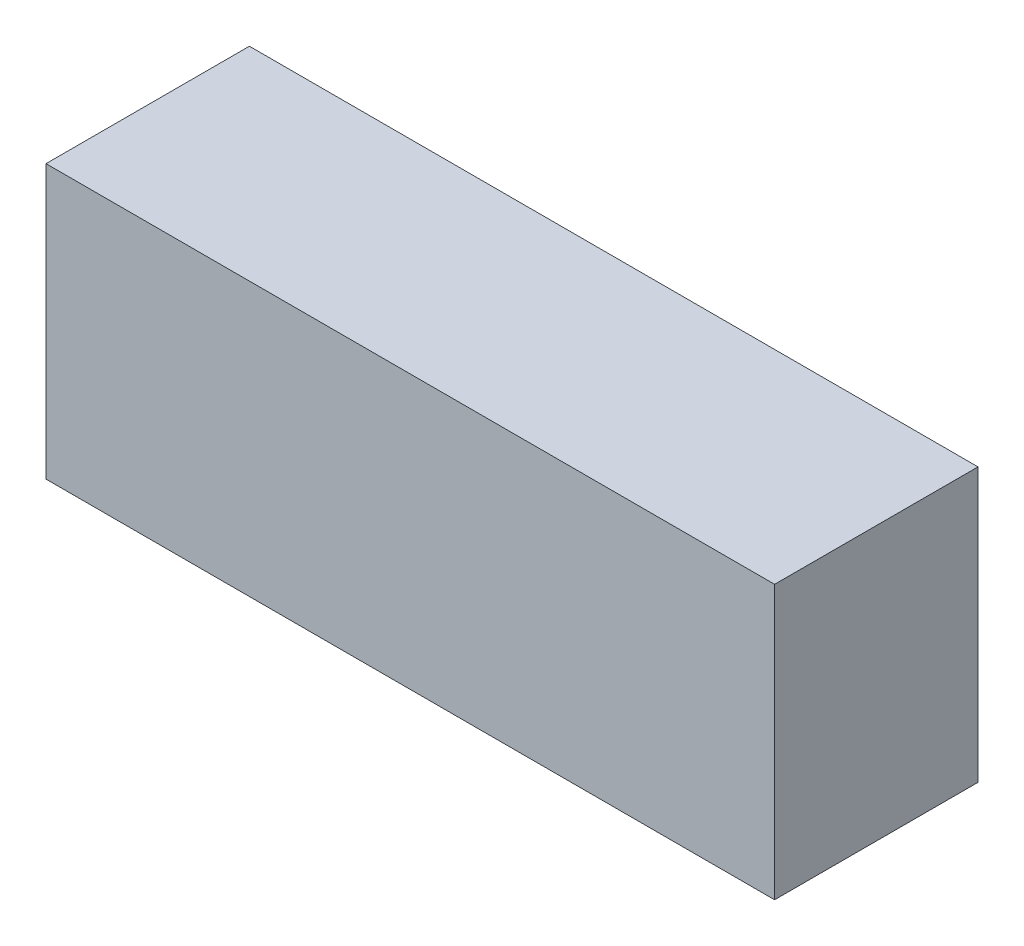
ISO-10303-21;
HEADER;
FILE_DESCRIPTION(('STEP AP214'),'2;1');
FILE_NAME('part.step','',(''),(''),'','','');
FILE_SCHEMA(('AUTOMOTIVE_DESIGN { 1 0 10303 214 1 1 1 1 }'));
ENDSEC;
DATA;
#1=APPLICATION_CONTEXT('core data for automotive mechanical design processes');
#2=APPLICATION_PROTOCOL_DEFINITION('international standard','automotive_design',2000,#1);
#3=PRODUCT_CONTEXT('',#1,'mechanical');
#4=PRODUCT('Part','Part','',(#3));
#5=PRODUCT_RELATED_PRODUCT_CATEGORY('part','',(#4));
#6=PRODUCT_DEFINITION_FORMATION('','',#4);
#7=PRODUCT_DEFINITION_CONTEXT('part definition',#1,'design');
#8=PRODUCT_DEFINITION('design','',#6,#7);
#9=PRODUCT_DEFINITION_SHAPE('','',#8);
#10=(LENGTH_UNIT() NAMED_UNIT(*) SI_UNIT(.MILLI.,.METRE.));
#11=(NAMED_UNIT(*) PLANE_ANGLE_UNIT() SI_UNIT($,.RADIAN.));
#12=(NAMED_UNIT(*) SI_UNIT($,.STERADIAN.) SOLID_ANGLE_UNIT());
#13=UNCERTAINTY_MEASURE_WITH_UNIT(LENGTH_MEASURE(1.E-05),#10,'distance_accuracy_value','');
#14=(GEOMETRIC_REPRESENTATION_CONTEXT(3) GLOBAL_UNCERTAINTY_ASSIGNED_CONTEXT((#13)) GLOBAL_UNIT_ASSIGNED_CONTEXT((#10,
#11,#12)) REPRESENTATION_CONTEXT('',''));
#15=CARTESIAN_POINT('',(0.,0.,0.));
#16=DIRECTION('',(0.,0.,1.));
#17=DIRECTION('',(1.,0.,0.));
#18=AXIS2_PLACEMENT_3D('',#15,#16,#17);
#19=CARTESIAN_POINT('',(-60.,-22.5,-33.5));
#20=DIRECTION('',(-1.,0.,0.));
#21=DIRECTION('',(0.,0.,1.));
#22=AXIS2_PLACEMENT_3D('',#19,#20,#21);
#23=PLANE('',#22);
#24=DIRECTION('',(0.,-1.,0.));
#25=VECTOR('',#24,1.);
#26=CARTESIAN_POINT('',(-60.,-22.5,0.));
#27=LINE('',#26,#25);
#28=CARTESIAN_POINT('',(-60.,22.5,0.));
#29=VERTEX_POINT('',#28);
#30=CARTESIAN_POINT('',(-60.,-22.5,0.));
#31=VERTEX_POINT('',#30);
#32=EDGE_CURVE('E101',#29,#31,#27,.T.);
#33=ORIENTED_EDGE('',*,*,#32,.F.);
#34=DIRECTION('',(0.,0.,1.));
#35=VECTOR('',#34,1.);
#36=CARTESIAN_POINT('',(-60.,22.5,-33.5));
#37=LINE('',#36,#35);
#38=CARTESIAN_POINT('',(-60.,22.5,-33.5));
#39=VERTEX_POINT('',#38);
#40=EDGE_CURVE('E11',#39,#29,#37,.T.);
#41=ORIENTED_EDGE('',*,*,#40,.F.);
#42=DIRECTION('',(0.,-1.,0.));
#43=VECTOR('',#42,1.);
#44=CARTESIAN_POINT('',(-60.,-22.5,-33.5));
#45=LINE('',#44,#43);
#46=CARTESIAN_POINT('',(-60.,-22.5,-33.5));
#47=VERTEX_POINT('',#46);
#48=EDGE_CURVE('E95',#39,#47,#45,.T.);
#49=ORIENTED_EDGE('',*,*,#48,.T.);
#50=DIRECTION('',(0.,0.,1.));
#51=VECTOR('',#50,1.);
#52=CARTESIAN_POINT('',(-60.,-22.5,-33.5));
#53=LINE('',#52,#51);
#54=EDGE_CURVE('E40',#47,#31,#53,.T.);
#55=ORIENTED_EDGE('',*,*,#54,.T.);
#56=EDGE_LOOP('',(#33,#41,#49,#55));
#57=FACE_BOUND('',#56,.T.);
#58=ADVANCED_FACE('F37',(#57),#23,.T.);
#59=CARTESIAN_POINT('',(60.,22.5,-33.5));
#60=DIRECTION('',(0.,1.,0.));
#61=DIRECTION('',(-1.,0.,0.));
#62=AXIS2_PLACEMENT_3D('',#59,#60,#61);
#63=PLANE('',#62);
#64=DIRECTION('',(-1.,0.,0.));
#65=VECTOR('',#64,1.);
#66=CARTESIAN_POINT('',(60.,22.5,0.));
#67=LINE('',#66,#65);
#68=CARTESIAN_POINT('',(60.,22.5,0.));
#69=VERTEX_POINT('',#68);
#70=EDGE_CURVE('E97',#69,#29,#67,.T.);
#71=ORIENTED_EDGE('',*,*,#70,.F.);
#72=DIRECTION('',(0.,0.,1.));
#73=VECTOR('',#72,1.);
#74=CARTESIAN_POINT('',(60.,22.5,-33.5));
#75=LINE('',#74,#73);
#76=CARTESIAN_POINT('',(60.,22.5,-33.5));
#77=VERTEX_POINT('',#76);
#78=EDGE_CURVE('E46',#77,#69,#75,.T.);
#79=ORIENTED_EDGE('',*,*,#78,.F.);
#80=DIRECTION('',(-1.,0.,0.));
#81=VECTOR('',#80,1.);
#82=CARTESIAN_POINT('',(60.,22.5,-33.5));
#83=LINE('',#82,#81);
#84=EDGE_CURVE('E92',#77,#39,#83,.T.);
#85=ORIENTED_EDGE('',*,*,#84,.T.);
#86=ORIENTED_EDGE('',*,*,#40,.T.);
#87=EDGE_LOOP('',(#71,#79,#85,#86));
#88=FACE_BOUND('',#87,.T.);
#89=ADVANCED_FACE('F111',(#88),#63,.T.);
#90=CARTESIAN_POINT('',(60.,-22.5,-33.5));
#91=DIRECTION('',(1.,0.,0.));
#92=DIRECTION('',(0.,0.,-1.));
#93=AXIS2_PLACEMENT_3D('',#90,#91,#92);
#94=PLANE('',#93);
#95=DIRECTION('',(0.,1.,0.));
#96=VECTOR('',#95,1.);
#97=CARTESIAN_POINT('',(60.,-22.5,0.));
#98=LINE('',#97,#96);
#99=CARTESIAN_POINT('',(60.,-22.5,0.));
#100=VERTEX_POINT('',#99);
#101=EDGE_CURVE('E87',#100,#69,#98,.T.);
#102=ORIENTED_EDGE('',*,*,#101,.F.);
#103=DIRECTION('',(0.,0.,1.));
#104=VECTOR('',#103,1.);
#105=CARTESIAN_POINT('',(60.,-22.5,-33.5));
#106=LINE('',#105,#104);
#107=CARTESIAN_POINT('',(60.,-22.5,-33.5));
#108=VERTEX_POINT('',#107);
#109=EDGE_CURVE('E82',#108,#100,#106,.T.);
#110=ORIENTED_EDGE('',*,*,#109,.F.);
#111=DIRECTION('',(0.,1.,0.));
#112=VECTOR('',#111,1.);
#113=CARTESIAN_POINT('',(60.,-22.5,-33.5));
#114=LINE('',#113,#112);
#115=EDGE_CURVE('E85',#108,#77,#114,.T.);
#116=ORIENTED_EDGE('',*,*,#115,.T.);
#117=ORIENTED_EDGE('',*,*,#78,.T.);
#118=EDGE_LOOP('',(#102,#110,#116,#117));
#119=FACE_BOUND('',#118,.T.);
#120=ADVANCED_FACE('F84',(#119),#94,.T.);
#121=CARTESIAN_POINT('',(60.,-22.5,-33.5));
#122=DIRECTION('',(0.,-1.,0.));
#123=DIRECTION('',(1.,0.,0.));
#124=AXIS2_PLACEMENT_3D('',#121,#122,#123);
#125=PLANE('',#124);
#126=DIRECTION('',(1.,0.,0.));
#127=VECTOR('',#126,1.);
#128=CARTESIAN_POINT('',(60.,-22.5,0.));
#129=LINE('',#128,#127);
#130=EDGE_CURVE('E104',#31,#100,#129,.T.);
#131=ORIENTED_EDGE('',*,*,#130,.F.);
#132=ORIENTED_EDGE('',*,*,#54,.F.);
#133=DIRECTION('',(1.,0.,0.));
#134=VECTOR('',#133,1.);
#135=CARTESIAN_POINT('',(60.,-22.5,-33.5));
#136=LINE('',#135,#134);
#137=EDGE_CURVE('E91',#47,#108,#136,.T.);
#138=ORIENTED_EDGE('',*,*,#137,.T.);
#139=ORIENTED_EDGE('',*,*,#109,.T.);
#140=EDGE_LOOP('',(#131,#132,#138,#139));
#141=FACE_BOUND('',#140,.T.);
#142=ADVANCED_FACE('F94',(#141),#125,.T.);
#143=CARTESIAN_POINT('',(0.,0.,-33.5));
#144=DIRECTION('',(0.,0.,1.));
#145=DIRECTION('',(1.,0.,0.));
#146=AXIS2_PLACEMENT_3D('',#143,#144,#145);
#147=PLANE('',#146);
#148=ORIENTED_EDGE('',*,*,#48,.F.);
#149=ORIENTED_EDGE('',*,*,#84,.F.);
#150=ORIENTED_EDGE('',*,*,#115,.F.);
#151=ORIENTED_EDGE('',*,*,#137,.F.);
#152=EDGE_LOOP('',(#148,#149,#150,#151));
#153=FACE_BOUND('',#152,.T.);
#154=ADVANCED_FACE('F90',(#153),#147,.F.);
#155=CARTESIAN_POINT('',(0.,0.,0.));
#156=DIRECTION('',(0.,0.,1.));
#157=DIRECTION('',(1.,0.,0.));
#158=AXIS2_PLACEMENT_3D('',#155,#156,#157);
#159=PLANE('',#158);
#160=ORIENTED_EDGE('',*,*,#32,.T.);
#161=ORIENTED_EDGE('',*,*,#130,.T.);
#162=ORIENTED_EDGE('',*,*,#101,.T.);
#163=ORIENTED_EDGE('',*,*,#70,.T.);
#164=EDGE_LOOP('',(#160,#161,#162,#163));
#165=FACE_BOUND('',#164,.T.);
#166=ADVANCED_FACE('F110',(#165),#159,.T.);
#167=CLOSED_SHELL('',(#58,#89,#120,#142,#154,#166));
#168=MANIFOLD_SOLID_BREP('B2',#167);
#169=ADVANCED_BREP_SHAPE_REPRESENTATION('',(#18,#168),#14);
#170=SHAPE_DEFINITION_REPRESENTATION(#9,#169);
ENDSEC;
END-ISO-10303-21;
